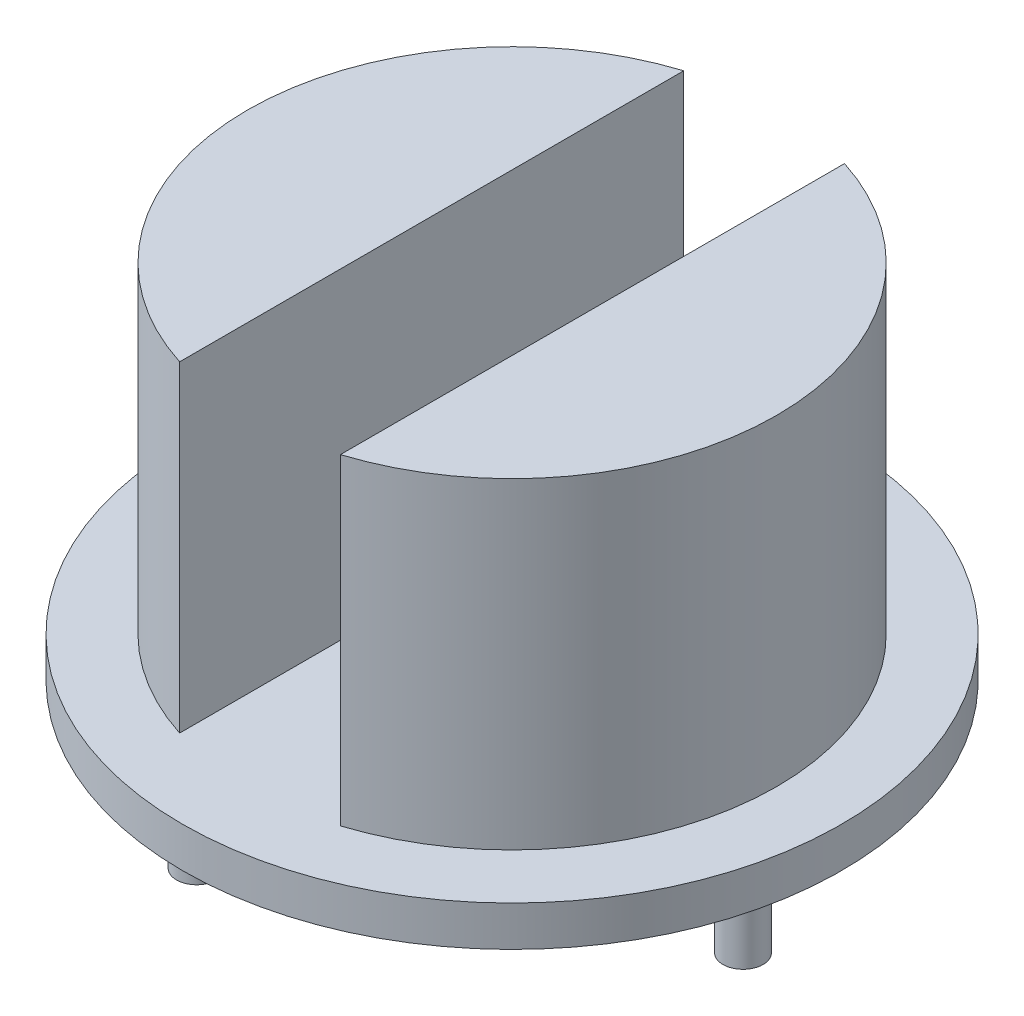
ISO-10303-21;
HEADER;
FILE_DESCRIPTION(('STEP AP214'),'2;1');
FILE_NAME('part.step','',(''),(''),'','','');
FILE_SCHEMA(('AUTOMOTIVE_DESIGN { 1 0 10303 214 1 1 1 1 }'));
ENDSEC;
DATA;
#1=APPLICATION_CONTEXT('core data for automotive mechanical design processes');
#2=APPLICATION_PROTOCOL_DEFINITION('international standard','automotive_design',2000,#1);
#3=PRODUCT_CONTEXT('',#1,'mechanical');
#4=PRODUCT('Part','Part','',(#3));
#5=PRODUCT_RELATED_PRODUCT_CATEGORY('part','',(#4));
#6=PRODUCT_DEFINITION_FORMATION('','',#4);
#7=PRODUCT_DEFINITION_CONTEXT('part definition',#1,'design');
#8=PRODUCT_DEFINITION('design','',#6,#7);
#9=PRODUCT_DEFINITION_SHAPE('','',#8);
#10=(LENGTH_UNIT() NAMED_UNIT(*) SI_UNIT(.MILLI.,.METRE.));
#11=(NAMED_UNIT(*) PLANE_ANGLE_UNIT() SI_UNIT($,.RADIAN.));
#12=(NAMED_UNIT(*) SI_UNIT($,.STERADIAN.) SOLID_ANGLE_UNIT());
#13=UNCERTAINTY_MEASURE_WITH_UNIT(LENGTH_MEASURE(1.E-05),#10,'distance_accuracy_value','');
#14=(GEOMETRIC_REPRESENTATION_CONTEXT(3) GLOBAL_UNCERTAINTY_ASSIGNED_CONTEXT((#13)) GLOBAL_UNIT_ASSIGNED_CONTEXT((#10,
#11,#12)) REPRESENTATION_CONTEXT('',''));
#15=CARTESIAN_POINT('',(0.,0.,0.));
#16=DIRECTION('',(0.,0.,1.));
#17=DIRECTION('',(1.,0.,0.));
#18=AXIS2_PLACEMENT_3D('',#15,#16,#17);
#19=CARTESIAN_POINT('',(0.,5.,0.));
#20=DIRECTION('',(0.,1.,0.));
#21=DIRECTION('',(0.,0.,1.));
#22=AXIS2_PLACEMENT_3D('',#19,#20,#21);
#23=PLANE('',#22);
#24=CARTESIAN_POINT('',(0.,5.,0.));
#25=DIRECTION('',(0.,1.,0.));
#26=DIRECTION('',(0.,0.,1.));
#27=AXIS2_PLACEMENT_3D('',#24,#25,#26);
#28=CIRCLE('',#27,41.);
#29=CARTESIAN_POINT('',(0.,5.,41.));
#30=VERTEX_POINT('',#29);
#31=EDGE_CURVE('E125',#30,#30,#28,.T.);
#32=ORIENTED_EDGE('',*,*,#31,.T.);
#33=EDGE_LOOP('',(#32));
#34=FACE_BOUND('',#33,.T.);
#35=DIRECTION('',(0.,0.,-1.));
#36=VECTOR('',#35,1.);
#37=CARTESIAN_POINT('',(-10.,5.,-31.3561592608743));
#38=LINE('',#37,#36);
#39=CARTESIAN_POINT('',(-10.,5.,31.3561592608743));
#40=VERTEX_POINT('',#39);
#41=CARTESIAN_POINT('',(-10.,5.,-31.3561592608743));
#42=VERTEX_POINT('',#41);
#43=EDGE_CURVE('E112',#40,#42,#38,.T.);
#44=ORIENTED_EDGE('',*,*,#43,.F.);
#45=CARTESIAN_POINT('',(0.,5.,0.));
#46=DIRECTION('',(0.,1.,0.));
#47=DIRECTION('',(0.,0.,1.));
#48=AXIS2_PLACEMENT_3D('',#45,#46,#47);
#49=CIRCLE('',#48,32.9121364179434);
#50=EDGE_CURVE('E64',#42,#40,#49,.T.);
#51=ORIENTED_EDGE('',*,*,#50,.F.);
#52=EDGE_LOOP('',(#44,#51));
#53=FACE_BOUND('',#52,.T.);
#54=DIRECTION('',(0.,0.,1.));
#55=VECTOR('',#54,1.);
#56=CARTESIAN_POINT('',(10.,5.,-31.3561592608743));
#57=LINE('',#56,#55);
#58=CARTESIAN_POINT('',(10.,5.,-31.3561592608743));
#59=VERTEX_POINT('',#58);
#60=CARTESIAN_POINT('',(10.,5.,31.3561592608743));
#61=VERTEX_POINT('',#60);
#62=EDGE_CURVE('E96',#59,#61,#57,.T.);
#63=ORIENTED_EDGE('',*,*,#62,.F.);
#64=CARTESIAN_POINT('',(0.,5.,0.));
#65=DIRECTION('',(0.,1.,0.));
#66=DIRECTION('',(0.,0.,1.));
#67=AXIS2_PLACEMENT_3D('',#64,#65,#66);
#68=CIRCLE('',#67,32.9121364179434);
#69=EDGE_CURVE('E56',#61,#59,#68,.T.);
#70=ORIENTED_EDGE('',*,*,#69,.F.);
#71=EDGE_LOOP('',(#63,#70));
#72=FACE_BOUND('',#71,.T.);
#73=ADVANCED_FACE('F41',(#34,#53,#72),#23,.T.);
#74=CARTESIAN_POINT('',(0.,5.,0.));
#75=DIRECTION('',(0.,-1.,0.));
#76=DIRECTION('',(0.,0.,-1.));
#77=AXIS2_PLACEMENT_3D('',#74,#75,#76);
#78=CYLINDRICAL_SURFACE('',#77,41.);
#79=ORIENTED_EDGE('',*,*,#31,.F.);
#80=EDGE_LOOP('',(#79));
#81=FACE_BOUND('',#80,.T.);
#82=CARTESIAN_POINT('',(0.,0.,0.));
#83=DIRECTION('',(0.,1.,0.));
#84=DIRECTION('',(0.,0.,1.));
#85=AXIS2_PLACEMENT_3D('',#82,#83,#84);
#86=CIRCLE('',#85,41.);
#87=CARTESIAN_POINT('',(0.,0.,41.));
#88=VERTEX_POINT('',#87);
#89=EDGE_CURVE('E122',#88,#88,#86,.T.);
#90=ORIENTED_EDGE('',*,*,#89,.T.);
#91=EDGE_LOOP('',(#90));
#92=FACE_BOUND('',#91,.T.);
#93=ADVANCED_FACE('F43',(#81,#92),#78,.T.);
#94=CARTESIAN_POINT('',(0.,0.,0.));
#95=DIRECTION('',(0.,1.,0.));
#96=DIRECTION('',(0.,0.,1.));
#97=AXIS2_PLACEMENT_3D('',#94,#95,#96);
#98=PLANE('',#97);
#99=CARTESIAN_POINT('',(28.730078071596,0.,0.));
#100=DIRECTION('',(0.,1.,0.));
#101=DIRECTION('',(0.,0.,1.));
#102=AXIS2_PLACEMENT_3D('',#99,#100,#101);
#103=CIRCLE('',#102,2.5);
#104=CARTESIAN_POINT('',(28.730078071596,0.,2.5));
#105=VERTEX_POINT('',#104);
#106=EDGE_CURVE('E11',#105,#105,#103,.F.);
#107=ORIENTED_EDGE('',*,*,#106,.F.);
#108=EDGE_LOOP('',(#107));
#109=FACE_BOUND('',#108,.T.);
#110=CARTESIAN_POINT('',(-14.365,0.,24.881));
#111=DIRECTION('',(0.,1.,0.));
#112=DIRECTION('',(0.,0.,1.));
#113=AXIS2_PLACEMENT_3D('',#110,#111,#112);
#114=CIRCLE('',#113,2.5);
#115=CARTESIAN_POINT('',(-14.365,0.,27.381));
#116=VERTEX_POINT('',#115);
#117=EDGE_CURVE('E49',#116,#116,#114,.F.);
#118=ORIENTED_EDGE('',*,*,#117,.F.);
#119=EDGE_LOOP('',(#118));
#120=FACE_BOUND('',#119,.T.);
#121=CARTESIAN_POINT('',(-14.365,0.,-24.881));
#122=DIRECTION('',(0.,1.,0.));
#123=DIRECTION('',(0.,0.,1.));
#124=AXIS2_PLACEMENT_3D('',#121,#122,#123);
#125=CIRCLE('',#124,2.5);
#126=CARTESIAN_POINT('',(-14.365,0.,-22.381));
#127=VERTEX_POINT('',#126);
#128=EDGE_CURVE('E128',#127,#127,#125,.F.);
#129=ORIENTED_EDGE('',*,*,#128,.F.);
#130=EDGE_LOOP('',(#129));
#131=FACE_BOUND('',#130,.T.);
#132=ORIENTED_EDGE('',*,*,#89,.F.);
#133=EDGE_LOOP('',(#132));
#134=FACE_BOUND('',#133,.T.);
#135=ADVANCED_FACE('F137',(#109,#120,#131,#134),#98,.F.);
#136=CARTESIAN_POINT('',(-14.365,-15.,-24.881));
#137=DIRECTION('',(0.,1.,0.));
#138=DIRECTION('',(0.,0.,1.));
#139=AXIS2_PLACEMENT_3D('',#136,#137,#138);
#140=CYLINDRICAL_SURFACE('',#139,2.5);
#141=CARTESIAN_POINT('',(-14.365,-15.,-24.881));
#142=DIRECTION('',(0.,-1.,0.));
#143=DIRECTION('',(0.,0.,-1.));
#144=AXIS2_PLACEMENT_3D('',#141,#142,#143);
#145=CIRCLE('',#144,2.5);
#146=CARTESIAN_POINT('',(-14.365,-15.,-27.381));
#147=VERTEX_POINT('',#146);
#148=EDGE_CURVE('E99',#147,#147,#145,.T.);
#149=ORIENTED_EDGE('',*,*,#148,.F.);
#150=EDGE_LOOP('',(#149));
#151=FACE_BOUND('',#150,.T.);
#152=ORIENTED_EDGE('',*,*,#128,.T.);
#153=EDGE_LOOP('',(#152));
#154=FACE_BOUND('',#153,.T.);
#155=ADVANCED_FACE('F140',(#151,#154),#140,.T.);
#156=CARTESIAN_POINT('',(-14.365,-15.,-24.881));
#157=DIRECTION('',(0.,-1.,0.));
#158=DIRECTION('',(0.,0.,-1.));
#159=AXIS2_PLACEMENT_3D('',#156,#157,#158);
#160=PLANE('',#159);
#161=ORIENTED_EDGE('',*,*,#148,.T.);
#162=EDGE_LOOP('',(#161));
#163=FACE_BOUND('',#162,.T.);
#164=ADVANCED_FACE('F186',(#163),#160,.T.);
#165=CARTESIAN_POINT('',(-14.365,-15.,24.881));
#166=DIRECTION('',(0.,1.,0.));
#167=DIRECTION('',(0.,0.,1.));
#168=AXIS2_PLACEMENT_3D('',#165,#166,#167);
#169=CYLINDRICAL_SURFACE('',#168,2.5);
#170=CARTESIAN_POINT('',(-14.365,-15.,24.881));
#171=DIRECTION('',(0.,-1.,0.));
#172=DIRECTION('',(0.,0.,-1.));
#173=AXIS2_PLACEMENT_3D('',#170,#171,#172);
#174=CIRCLE('',#173,2.5);
#175=CARTESIAN_POINT('',(-14.365,-15.,22.381));
#176=VERTEX_POINT('',#175);
#177=EDGE_CURVE('E102',#176,#176,#174,.T.);
#178=ORIENTED_EDGE('',*,*,#177,.F.);
#179=EDGE_LOOP('',(#178));
#180=FACE_BOUND('',#179,.T.);
#181=ORIENTED_EDGE('',*,*,#117,.T.);
#182=EDGE_LOOP('',(#181));
#183=FACE_BOUND('',#182,.T.);
#184=ADVANCED_FACE('F135',(#180,#183),#169,.T.);
#185=CARTESIAN_POINT('',(-14.365,-15.,24.881));
#186=DIRECTION('',(0.,-1.,0.));
#187=DIRECTION('',(0.,0.,-1.));
#188=AXIS2_PLACEMENT_3D('',#185,#186,#187);
#189=PLANE('',#188);
#190=ORIENTED_EDGE('',*,*,#177,.T.);
#191=EDGE_LOOP('',(#190));
#192=FACE_BOUND('',#191,.T.);
#193=ADVANCED_FACE('F182',(#192),#189,.T.);
#194=CARTESIAN_POINT('',(28.730078071596,-15.,0.));
#195=DIRECTION('',(0.,1.,0.));
#196=DIRECTION('',(0.,0.,1.));
#197=AXIS2_PLACEMENT_3D('',#194,#195,#196);
#198=CYLINDRICAL_SURFACE('',#197,2.5);
#199=CARTESIAN_POINT('',(28.730078071596,-15.,0.));
#200=DIRECTION('',(0.,-1.,0.));
#201=DIRECTION('',(0.,0.,-1.));
#202=AXIS2_PLACEMENT_3D('',#199,#200,#201);
#203=CIRCLE('',#202,2.5);
#204=CARTESIAN_POINT('',(28.730078071596,-15.,-2.5));
#205=VERTEX_POINT('',#204);
#206=EDGE_CURVE('E119',#205,#205,#203,.T.);
#207=ORIENTED_EDGE('',*,*,#206,.F.);
#208=EDGE_LOOP('',(#207));
#209=FACE_BOUND('',#208,.T.);
#210=ORIENTED_EDGE('',*,*,#106,.T.);
#211=EDGE_LOOP('',(#210));
#212=FACE_BOUND('',#211,.T.);
#213=ADVANCED_FACE('F178',(#209,#212),#198,.T.);
#214=CARTESIAN_POINT('',(28.730078071596,-15.,0.));
#215=DIRECTION('',(0.,-1.,0.));
#216=DIRECTION('',(0.,0.,-1.));
#217=AXIS2_PLACEMENT_3D('',#214,#215,#216);
#218=PLANE('',#217);
#219=ORIENTED_EDGE('',*,*,#206,.T.);
#220=EDGE_LOOP('',(#219));
#221=FACE_BOUND('',#220,.T.);
#222=ADVANCED_FACE('F175',(#221),#218,.T.);
#223=CARTESIAN_POINT('',(0.,45.,0.));
#224=DIRECTION('',(0.,-1.,0.));
#225=DIRECTION('',(0.,0.,-1.));
#226=AXIS2_PLACEMENT_3D('',#223,#224,#225);
#227=CYLINDRICAL_SURFACE('',#226,32.9121364179434);
#228=ORIENTED_EDGE('',*,*,#50,.T.);
#229=DIRECTION('',(0.,-1.,0.));
#230=VECTOR('',#229,1.);
#231=CARTESIAN_POINT('',(-10.,45.,31.3561592608743));
#232=LINE('',#231,#230);
#233=CARTESIAN_POINT('',(-10.,45.,31.3561592608743));
#234=VERTEX_POINT('',#233);
#235=EDGE_CURVE('E107',#234,#40,#232,.T.);
#236=ORIENTED_EDGE('',*,*,#235,.F.);
#237=CARTESIAN_POINT('',(0.,45.,0.));
#238=DIRECTION('',(0.,1.,0.));
#239=DIRECTION('',(0.,0.,1.));
#240=AXIS2_PLACEMENT_3D('',#237,#238,#239);
#241=CIRCLE('',#240,32.9121364179434);
#242=CARTESIAN_POINT('',(-10.,45.,-31.3561592608743));
#243=VERTEX_POINT('',#242);
#244=EDGE_CURVE('E114',#243,#234,#241,.T.);
#245=ORIENTED_EDGE('',*,*,#244,.F.);
#246=DIRECTION('',(0.,-1.,0.));
#247=VECTOR('',#246,1.);
#248=CARTESIAN_POINT('',(-10.,45.,-31.3561592608743));
#249=LINE('',#248,#247);
#250=EDGE_CURVE('E109',#243,#42,#249,.T.);
#251=ORIENTED_EDGE('',*,*,#250,.T.);
#252=EDGE_LOOP('',(#228,#236,#245,#251));
#253=FACE_BOUND('',#252,.T.);
#254=ADVANCED_FACE('F162',(#253),#227,.T.);
#255=CARTESIAN_POINT('',(-10.,45.,-31.3561592608743));
#256=DIRECTION('',(-1.,0.,0.));
#257=DIRECTION('',(0.,0.,1.));
#258=AXIS2_PLACEMENT_3D('',#255,#256,#257);
#259=PLANE('',#258);
#260=ORIENTED_EDGE('',*,*,#43,.T.);
#261=ORIENTED_EDGE('',*,*,#250,.F.);
#262=DIRECTION('',(0.,0.,-1.));
#263=VECTOR('',#262,1.);
#264=CARTESIAN_POINT('',(-10.,45.,-31.3561592608743));
#265=LINE('',#264,#263);
#266=EDGE_CURVE('E111',#234,#243,#265,.T.);
#267=ORIENTED_EDGE('',*,*,#266,.F.);
#268=ORIENTED_EDGE('',*,*,#235,.T.);
#269=EDGE_LOOP('',(#260,#261,#267,#268));
#270=FACE_BOUND('',#269,.T.);
#271=ADVANCED_FACE('F160',(#270),#259,.F.);
#272=CARTESIAN_POINT('',(0.,45.,0.));
#273=DIRECTION('',(0.,1.,0.));
#274=DIRECTION('',(0.,0.,1.));
#275=AXIS2_PLACEMENT_3D('',#272,#273,#274);
#276=PLANE('',#275);
#277=ORIENTED_EDGE('',*,*,#244,.T.);
#278=ORIENTED_EDGE('',*,*,#266,.T.);
#279=EDGE_LOOP('',(#277,#278));
#280=FACE_BOUND('',#279,.T.);
#281=ADVANCED_FACE('F164',(#280),#276,.T.);
#282=CARTESIAN_POINT('',(0.,45.,0.));
#283=DIRECTION('',(0.,-1.,0.));
#284=DIRECTION('',(0.,0.,-1.));
#285=AXIS2_PLACEMENT_3D('',#282,#283,#284);
#286=CYLINDRICAL_SURFACE('',#285,32.9121364179434);
#287=ORIENTED_EDGE('',*,*,#69,.T.);
#288=DIRECTION('',(0.,-1.,0.));
#289=VECTOR('',#288,1.);
#290=CARTESIAN_POINT('',(10.,45.,-31.3561592608743));
#291=LINE('',#290,#289);
#292=CARTESIAN_POINT('',(10.,45.,-31.3561592608743));
#293=VERTEX_POINT('',#292);
#294=EDGE_CURVE('E88',#293,#59,#291,.T.);
#295=ORIENTED_EDGE('',*,*,#294,.F.);
#296=CARTESIAN_POINT('',(0.,45.,0.));
#297=DIRECTION('',(0.,1.,0.));
#298=DIRECTION('',(0.,0.,1.));
#299=AXIS2_PLACEMENT_3D('',#296,#297,#298);
#300=CIRCLE('',#299,32.9121364179434);
#301=CARTESIAN_POINT('',(10.,45.,31.3561592608743));
#302=VERTEX_POINT('',#301);
#303=EDGE_CURVE('E93',#302,#293,#300,.T.);
#304=ORIENTED_EDGE('',*,*,#303,.F.);
#305=DIRECTION('',(0.,-1.,0.));
#306=VECTOR('',#305,1.);
#307=CARTESIAN_POINT('',(10.,45.,31.3561592608743));
#308=LINE('',#307,#306);
#309=EDGE_CURVE('E90',#302,#61,#308,.T.);
#310=ORIENTED_EDGE('',*,*,#309,.T.);
#311=EDGE_LOOP('',(#287,#295,#304,#310));
#312=FACE_BOUND('',#311,.T.);
#313=ADVANCED_FACE('F98',(#312),#286,.T.);
#314=CARTESIAN_POINT('',(10.,45.,-31.3561592608743));
#315=DIRECTION('',(1.,0.,0.));
#316=DIRECTION('',(0.,0.,-1.));
#317=AXIS2_PLACEMENT_3D('',#314,#315,#316);
#318=PLANE('',#317);
#319=ORIENTED_EDGE('',*,*,#62,.T.);
#320=ORIENTED_EDGE('',*,*,#309,.F.);
#321=DIRECTION('',(0.,0.,1.));
#322=VECTOR('',#321,1.);
#323=CARTESIAN_POINT('',(10.,45.,-31.3561592608743));
#324=LINE('',#323,#322);
#325=EDGE_CURVE('E85',#293,#302,#324,.T.);
#326=ORIENTED_EDGE('',*,*,#325,.F.);
#327=ORIENTED_EDGE('',*,*,#294,.T.);
#328=EDGE_LOOP('',(#319,#320,#326,#327));
#329=FACE_BOUND('',#328,.T.);
#330=ADVANCED_FACE('F87',(#329),#318,.F.);
#331=CARTESIAN_POINT('',(0.,45.,0.));
#332=DIRECTION('',(0.,1.,0.));
#333=DIRECTION('',(0.,0.,1.));
#334=AXIS2_PLACEMENT_3D('',#331,#332,#333);
#335=PLANE('',#334);
#336=ORIENTED_EDGE('',*,*,#303,.T.);
#337=ORIENTED_EDGE('',*,*,#325,.T.);
#338=EDGE_LOOP('',(#336,#337));
#339=FACE_BOUND('',#338,.T.);
#340=ADVANCED_FACE('F95',(#339),#335,.T.);
#341=CLOSED_SHELL('',(#73,#93,#135,#155,#164,#184,#193,#213,#222,#254,#271,#281,#313,#330,#340));
#342=MANIFOLD_SOLID_BREP('B2',#341);
#343=ADVANCED_BREP_SHAPE_REPRESENTATION('',(#18,#342),#14);
#344=SHAPE_DEFINITION_REPRESENTATION(#9,#343);
ENDSEC;
END-ISO-10303-21;
